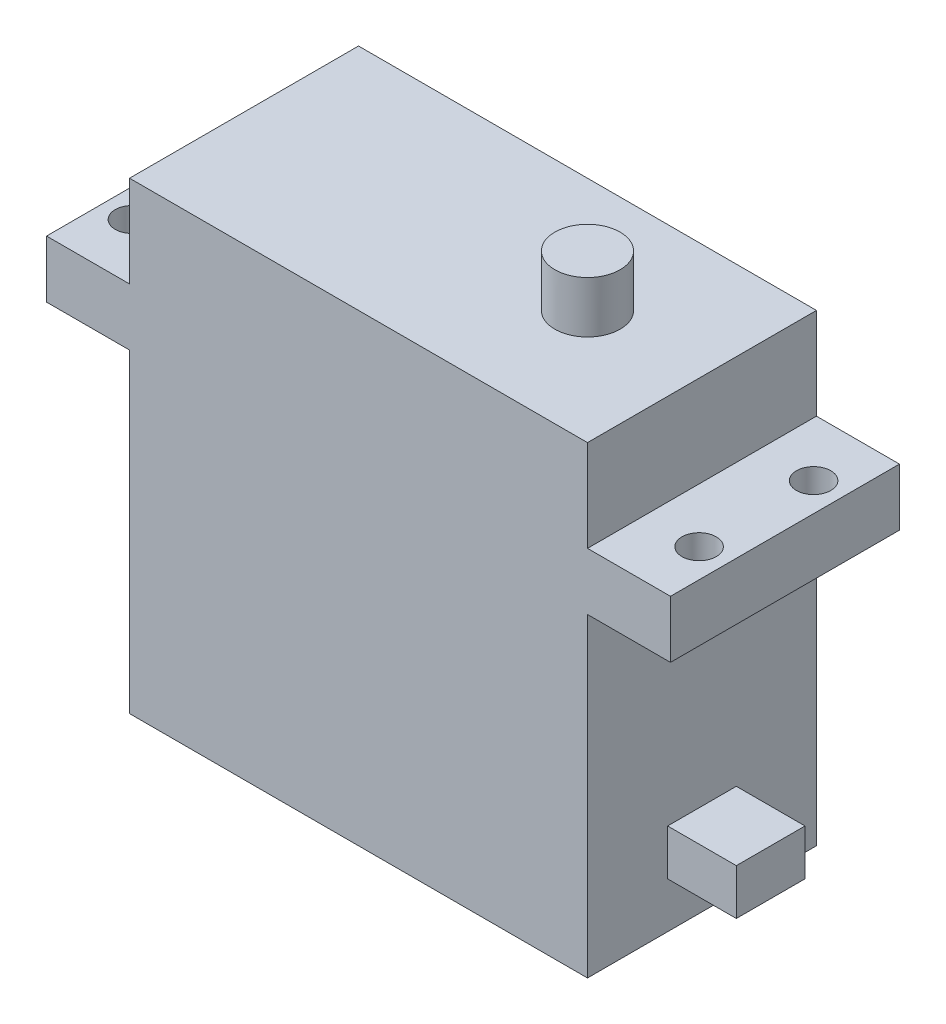
ISO-10303-21;
HEADER;
FILE_DESCRIPTION(('STEP AP214'),'2;1');
FILE_NAME('part.step','',(''),(''),'','','');
FILE_SCHEMA(('AUTOMOTIVE_DESIGN { 1 0 10303 214 1 1 1 1 }'));
ENDSEC;
DATA;
#1=APPLICATION_CONTEXT('core data for automotive mechanical design processes');
#2=APPLICATION_PROTOCOL_DEFINITION('international standard','automotive_design',2000,#1);
#3=PRODUCT_CONTEXT('',#1,'mechanical');
#4=PRODUCT('Part','Part','',(#3));
#5=PRODUCT_RELATED_PRODUCT_CATEGORY('part','',(#4));
#6=PRODUCT_DEFINITION_FORMATION('','',#4);
#7=PRODUCT_DEFINITION_CONTEXT('part definition',#1,'design');
#8=PRODUCT_DEFINITION('design','',#6,#7);
#9=PRODUCT_DEFINITION_SHAPE('','',#8);
#10=(LENGTH_UNIT() NAMED_UNIT(*) SI_UNIT(.MILLI.,.METRE.));
#11=(NAMED_UNIT(*) PLANE_ANGLE_UNIT() SI_UNIT($,.RADIAN.));
#12=(NAMED_UNIT(*) SI_UNIT($,.STERADIAN.) SOLID_ANGLE_UNIT());
#13=UNCERTAINTY_MEASURE_WITH_UNIT(LENGTH_MEASURE(1.E-05),#10,'distance_accuracy_value','');
#14=(GEOMETRIC_REPRESENTATION_CONTEXT(3) GLOBAL_UNCERTAINTY_ASSIGNED_CONTEXT((#13)) GLOBAL_UNIT_ASSIGNED_CONTEXT((#10,
#11,#12)) REPRESENTATION_CONTEXT('',''));
#15=CARTESIAN_POINT('',(0.,0.,0.));
#16=DIRECTION('',(0.,0.,1.));
#17=DIRECTION('',(1.,0.,0.));
#18=AXIS2_PLACEMENT_3D('',#15,#16,#17);
#19=CARTESIAN_POINT('',(20.,0.,20.));
#20=DIRECTION('',(1.,0.,0.));
#21=DIRECTION('',(0.,0.,-1.));
#22=AXIS2_PLACEMENT_3D('',#19,#20,#21);
#23=PLANE('',#22);
#24=DIRECTION('',(0.,-1.,0.));
#25=VECTOR('',#24,1.);
#26=CARTESIAN_POINT('',(20.,0.,0.));
#27=LINE('',#26,#25);
#28=CARTESIAN_POINT('',(20.,-13.,0.));
#29=VERTEX_POINT('',#28);
#30=CARTESIAN_POINT('',(20.,-40.5,0.));
#31=VERTEX_POINT('',#30);
#32=EDGE_CURVE('E209',#29,#31,#27,.T.);
#33=ORIENTED_EDGE('',*,*,#32,.F.);
#34=DIRECTION('',(0.,0.,-1.));
#35=VECTOR('',#34,1.);
#36=CARTESIAN_POINT('',(20.,-13.,20.));
#37=LINE('',#36,#35);
#38=CARTESIAN_POINT('',(20.,-13.,20.));
#39=VERTEX_POINT('',#38);
#40=EDGE_CURVE('E227',#39,#29,#37,.T.);
#41=ORIENTED_EDGE('',*,*,#40,.F.);
#42=DIRECTION('',(0.,-1.,0.));
#43=VECTOR('',#42,1.);
#44=CARTESIAN_POINT('',(20.,0.,20.));
#45=LINE('',#44,#43);
#46=CARTESIAN_POINT('',(20.,-40.5,20.));
#47=VERTEX_POINT('',#46);
#48=EDGE_CURVE('E270',#39,#47,#45,.T.);
#49=ORIENTED_EDGE('',*,*,#48,.T.);
#50=DIRECTION('',(0.,0.,-1.));
#51=VECTOR('',#50,1.);
#52=CARTESIAN_POINT('',(20.,-40.5,20.));
#53=LINE('',#52,#51);
#54=EDGE_CURVE('E229',#47,#31,#53,.T.);
#55=ORIENTED_EDGE('',*,*,#54,.T.);
#56=EDGE_LOOP('',(#33,#41,#49,#55));
#57=FACE_BOUND('',#56,.T.);
#58=DIRECTION('',(0.,0.,1.));
#59=VECTOR('',#58,1.);
#60=CARTESIAN_POINT('',(20.,-32.5,13.));
#61=LINE('',#60,#59);
#62=CARTESIAN_POINT('',(20.,-32.5,7.));
#63=VERTEX_POINT('',#62);
#64=CARTESIAN_POINT('',(20.,-32.5,13.));
#65=VERTEX_POINT('',#64);
#66=EDGE_CURVE('E448',#63,#65,#61,.T.);
#67=ORIENTED_EDGE('',*,*,#66,.F.);
#68=DIRECTION('',(0.,1.,0.));
#69=VECTOR('',#68,1.);
#70=CARTESIAN_POINT('',(20.,-32.5,7.));
#71=LINE('',#70,#69);
#72=CARTESIAN_POINT('',(20.,-36.5,7.));
#73=VERTEX_POINT('',#72);
#74=EDGE_CURVE('E422',#73,#63,#71,.T.);
#75=ORIENTED_EDGE('',*,*,#74,.F.);
#76=DIRECTION('',(0.,0.,-1.));
#77=VECTOR('',#76,1.);
#78=CARTESIAN_POINT('',(20.,-36.5,13.));
#79=LINE('',#78,#77);
#80=CARTESIAN_POINT('',(20.,-36.5,13.));
#81=VERTEX_POINT('',#80);
#82=EDGE_CURVE('E415',#81,#73,#79,.T.);
#83=ORIENTED_EDGE('',*,*,#82,.F.);
#84=DIRECTION('',(0.,-1.,0.));
#85=VECTOR('',#84,1.);
#86=CARTESIAN_POINT('',(20.,-32.5,13.));
#87=LINE('',#86,#85);
#88=EDGE_CURVE('E446',#65,#81,#87,.T.);
#89=ORIENTED_EDGE('',*,*,#88,.F.);
#90=EDGE_LOOP('',(#67,#75,#83,#89));
#91=FACE_BOUND('',#90,.T.);
#92=ADVANCED_FACE('F53',(#57,#91),#23,.T.);
#93=CARTESIAN_POINT('',(-20.,0.,20.));
#94=DIRECTION('',(1.,0.,0.));
#95=DIRECTION('',(0.,0.,-1.));
#96=AXIS2_PLACEMENT_3D('',#93,#94,#95);
#97=PLANE('',#96);
#98=DIRECTION('',(0.,-1.,0.));
#99=VECTOR('',#98,1.);
#100=CARTESIAN_POINT('',(-20.,0.,0.));
#101=LINE('',#100,#99);
#102=CARTESIAN_POINT('',(-20.,0.,0.));
#103=VERTEX_POINT('',#102);
#104=CARTESIAN_POINT('',(-20.,-8.,0.));
#105=VERTEX_POINT('',#104);
#106=EDGE_CURVE('E190',#103,#105,#101,.T.);
#107=ORIENTED_EDGE('',*,*,#106,.T.);
#108=DIRECTION('',(0.,0.,-1.));
#109=VECTOR('',#108,1.);
#110=CARTESIAN_POINT('',(-20.,-8.,20.));
#111=LINE('',#110,#109);
#112=CARTESIAN_POINT('',(-20.,-8.,20.));
#113=VERTEX_POINT('',#112);
#114=EDGE_CURVE('E62',#113,#105,#111,.T.);
#115=ORIENTED_EDGE('',*,*,#114,.F.);
#116=DIRECTION('',(0.,-1.,0.));
#117=VECTOR('',#116,1.);
#118=CARTESIAN_POINT('',(-20.,0.,20.));
#119=LINE('',#118,#117);
#120=CARTESIAN_POINT('',(-20.,0.,20.));
#121=VERTEX_POINT('',#120);
#122=EDGE_CURVE('E221',#121,#113,#119,.T.);
#123=ORIENTED_EDGE('',*,*,#122,.F.);
#124=DIRECTION('',(0.,0.,-1.));
#125=VECTOR('',#124,1.);
#126=CARTESIAN_POINT('',(-20.,0.,20.));
#127=LINE('',#126,#125);
#128=EDGE_CURVE('E186',#121,#103,#127,.T.);
#129=ORIENTED_EDGE('',*,*,#128,.T.);
#130=EDGE_LOOP('',(#107,#115,#123,#129));
#131=FACE_BOUND('',#130,.T.);
#132=ADVANCED_FACE('F55',(#131),#97,.F.);
#133=CARTESIAN_POINT('',(0.,-8.,20.));
#134=DIRECTION('',(0.,-1.,0.));
#135=DIRECTION('',(1.,0.,0.));
#136=AXIS2_PLACEMENT_3D('',#133,#134,#135);
#137=PLANE('',#136);
#138=CARTESIAN_POINT('',(-24.75,-8.00000000000001,15.));
#139=DIRECTION('',(0.,1.,0.));
#140=DIRECTION('',(-1.,0.,0.));
#141=AXIS2_PLACEMENT_3D('',#138,#139,#140);
#142=CIRCLE('',#141,1.5);
#143=CARTESIAN_POINT('',(-26.25,-8.00000000000001,15.));
#144=VERTEX_POINT('',#143);
#145=EDGE_CURVE('E330',#144,#144,#142,.T.);
#146=ORIENTED_EDGE('',*,*,#145,.F.);
#147=EDGE_LOOP('',(#146));
#148=FACE_BOUND('',#147,.T.);
#149=CARTESIAN_POINT('',(-24.75,-8.00000000000001,5.00000000000001));
#150=DIRECTION('',(0.,1.,0.));
#151=DIRECTION('',(-1.,0.,0.));
#152=AXIS2_PLACEMENT_3D('',#149,#150,#151);
#153=CIRCLE('',#152,1.5);
#154=CARTESIAN_POINT('',(-26.25,-8.00000000000001,5.00000000000001));
#155=VERTEX_POINT('',#154);
#156=EDGE_CURVE('E251',#155,#155,#153,.T.);
#157=ORIENTED_EDGE('',*,*,#156,.F.);
#158=EDGE_LOOP('',(#157));
#159=FACE_BOUND('',#158,.T.);
#160=DIRECTION('',(-1.,0.,0.));
#161=VECTOR('',#160,1.);
#162=CARTESIAN_POINT('',(0.,-8.,0.));
#163=LINE('',#162,#161);
#164=CARTESIAN_POINT('',(-27.25,-8.00000000000001,0.));
#165=VERTEX_POINT('',#164);
#166=EDGE_CURVE('E193',#105,#165,#163,.T.);
#167=ORIENTED_EDGE('',*,*,#166,.T.);
#168=DIRECTION('',(0.,0.,-1.));
#169=VECTOR('',#168,1.);
#170=CARTESIAN_POINT('',(-27.25,-8.00000000000001,20.));
#171=LINE('',#170,#169);
#172=CARTESIAN_POINT('',(-27.25,-8.00000000000001,20.));
#173=VERTEX_POINT('',#172);
#174=EDGE_CURVE('E237',#173,#165,#171,.T.);
#175=ORIENTED_EDGE('',*,*,#174,.F.);
#176=DIRECTION('',(-1.,0.,0.));
#177=VECTOR('',#176,1.);
#178=CARTESIAN_POINT('',(0.,-8.,20.));
#179=LINE('',#178,#177);
#180=EDGE_CURVE('E133',#113,#173,#179,.T.);
#181=ORIENTED_EDGE('',*,*,#180,.F.);
#182=ORIENTED_EDGE('',*,*,#114,.T.);
#183=EDGE_LOOP('',(#167,#175,#181,#182));
#184=FACE_BOUND('',#183,.T.);
#185=ADVANCED_FACE('F306',(#148,#159,#184),#137,.F.);
#186=CARTESIAN_POINT('',(-27.25,0.,20.));
#187=DIRECTION('',(-1.,0.,0.));
#188=DIRECTION('',(0.,0.,1.));
#189=AXIS2_PLACEMENT_3D('',#186,#187,#188);
#190=PLANE('',#189);
#191=DIRECTION('',(0.,1.,0.));
#192=VECTOR('',#191,1.);
#193=CARTESIAN_POINT('',(-27.25,0.,0.));
#194=LINE('',#193,#192);
#195=CARTESIAN_POINT('',(-27.25,-13.,0.));
#196=VERTEX_POINT('',#195);
#197=EDGE_CURVE('E197',#196,#165,#194,.T.);
#198=ORIENTED_EDGE('',*,*,#197,.F.);
#199=DIRECTION('',(0.,0.,-1.));
#200=VECTOR('',#199,1.);
#201=CARTESIAN_POINT('',(-27.25,-13.,20.));
#202=LINE('',#201,#200);
#203=CARTESIAN_POINT('',(-27.25,-13.,20.));
#204=VERTEX_POINT('',#203);
#205=EDGE_CURVE('E235',#204,#196,#202,.T.);
#206=ORIENTED_EDGE('',*,*,#205,.F.);
#207=DIRECTION('',(0.,1.,0.));
#208=VECTOR('',#207,1.);
#209=CARTESIAN_POINT('',(-27.25,0.,20.));
#210=LINE('',#209,#208);
#211=EDGE_CURVE('E259',#204,#173,#210,.T.);
#212=ORIENTED_EDGE('',*,*,#211,.T.);
#213=ORIENTED_EDGE('',*,*,#174,.T.);
#214=EDGE_LOOP('',(#198,#206,#212,#213));
#215=FACE_BOUND('',#214,.T.);
#216=ADVANCED_FACE('F319',(#215),#190,.T.);
#217=CARTESIAN_POINT('',(0.,-13.,20.));
#218=DIRECTION('',(0.,-1.,0.));
#219=DIRECTION('',(1.,0.,0.));
#220=AXIS2_PLACEMENT_3D('',#217,#218,#219);
#221=PLANE('',#220);
#222=CARTESIAN_POINT('',(-24.75,-13.,15.));
#223=DIRECTION('',(0.,-1.,0.));
#224=DIRECTION('',(1.,0.,0.));
#225=AXIS2_PLACEMENT_3D('',#222,#223,#224);
#226=CIRCLE('',#225,1.5);
#227=CARTESIAN_POINT('',(-23.25,-13.,15.));
#228=VERTEX_POINT('',#227);
#229=EDGE_CURVE('E57',#228,#228,#226,.T.);
#230=ORIENTED_EDGE('',*,*,#229,.F.);
#231=EDGE_LOOP('',(#230));
#232=FACE_BOUND('',#231,.T.);
#233=CARTESIAN_POINT('',(-24.75,-13.,5.00000000000001));
#234=DIRECTION('',(0.,-1.,0.));
#235=DIRECTION('',(1.,0.,0.));
#236=AXIS2_PLACEMENT_3D('',#233,#234,#235);
#237=CIRCLE('',#236,1.5);
#238=CARTESIAN_POINT('',(-23.25,-13.,5.00000000000001));
#239=VERTEX_POINT('',#238);
#240=EDGE_CURVE('E239',#239,#239,#237,.T.);
#241=ORIENTED_EDGE('',*,*,#240,.F.);
#242=EDGE_LOOP('',(#241));
#243=FACE_BOUND('',#242,.T.);
#244=DIRECTION('',(-1.,0.,0.));
#245=VECTOR('',#244,1.);
#246=CARTESIAN_POINT('',(0.,-13.,0.));
#247=LINE('',#246,#245);
#248=CARTESIAN_POINT('',(-20.,-13.,0.));
#249=VERTEX_POINT('',#248);
#250=EDGE_CURVE('E200',#249,#196,#247,.T.);
#251=ORIENTED_EDGE('',*,*,#250,.F.);
#252=DIRECTION('',(0.,0.,-1.));
#253=VECTOR('',#252,1.);
#254=CARTESIAN_POINT('',(-20.,-13.,20.));
#255=LINE('',#254,#253);
#256=CARTESIAN_POINT('',(-20.,-13.,20.));
#257=VERTEX_POINT('',#256);
#258=EDGE_CURVE('E233',#257,#249,#255,.T.);
#259=ORIENTED_EDGE('',*,*,#258,.F.);
#260=DIRECTION('',(-1.,0.,0.));
#261=VECTOR('',#260,1.);
#262=CARTESIAN_POINT('',(0.,-13.,20.));
#263=LINE('',#262,#261);
#264=EDGE_CURVE('E262',#257,#204,#263,.T.);
#265=ORIENTED_EDGE('',*,*,#264,.T.);
#266=ORIENTED_EDGE('',*,*,#205,.T.);
#267=EDGE_LOOP('',(#251,#259,#265,#266));
#268=FACE_BOUND('',#267,.T.);
#269=ADVANCED_FACE('F315',(#232,#243,#268),#221,.T.);
#270=CARTESIAN_POINT('',(-20.,0.,20.));
#271=DIRECTION('',(1.,0.,0.));
#272=DIRECTION('',(0.,0.,-1.));
#273=AXIS2_PLACEMENT_3D('',#270,#271,#272);
#274=PLANE('',#273);
#275=DIRECTION('',(0.,-1.,0.));
#276=VECTOR('',#275,1.);
#277=CARTESIAN_POINT('',(-20.,0.,0.));
#278=LINE('',#277,#276);
#279=CARTESIAN_POINT('',(-20.,-40.5,0.));
#280=VERTEX_POINT('',#279);
#281=EDGE_CURVE('E203',#249,#280,#278,.T.);
#282=ORIENTED_EDGE('',*,*,#281,.T.);
#283=DIRECTION('',(0.,0.,-1.));
#284=VECTOR('',#283,1.);
#285=CARTESIAN_POINT('',(-20.,-40.5,20.));
#286=LINE('',#285,#284);
#287=CARTESIAN_POINT('',(-20.,-40.5,20.));
#288=VERTEX_POINT('',#287);
#289=EDGE_CURVE('E231',#288,#280,#286,.T.);
#290=ORIENTED_EDGE('',*,*,#289,.F.);
#291=DIRECTION('',(0.,-1.,0.));
#292=VECTOR('',#291,1.);
#293=CARTESIAN_POINT('',(-20.,0.,20.));
#294=LINE('',#293,#292);
#295=EDGE_CURVE('E265',#257,#288,#294,.T.);
#296=ORIENTED_EDGE('',*,*,#295,.F.);
#297=ORIENTED_EDGE('',*,*,#258,.T.);
#298=EDGE_LOOP('',(#282,#290,#296,#297));
#299=FACE_BOUND('',#298,.T.);
#300=ADVANCED_FACE('F311',(#299),#274,.F.);
#301=CARTESIAN_POINT('',(0.,-40.5,20.));
#302=DIRECTION('',(0.,-1.,0.));
#303=DIRECTION('',(0.,0.,-1.));
#304=AXIS2_PLACEMENT_3D('',#301,#302,#303);
#305=PLANE('',#304);
#306=DIRECTION('',(-1.,0.,0.));
#307=VECTOR('',#306,1.);
#308=CARTESIAN_POINT('',(0.,-40.5,0.));
#309=LINE('',#308,#307);
#310=EDGE_CURVE('E206',#31,#280,#309,.T.);
#311=ORIENTED_EDGE('',*,*,#310,.F.);
#312=ORIENTED_EDGE('',*,*,#54,.F.);
#313=DIRECTION('',(-1.,0.,0.));
#314=VECTOR('',#313,1.);
#315=CARTESIAN_POINT('',(0.,-40.5,20.));
#316=LINE('',#315,#314);
#317=EDGE_CURVE('E267',#47,#288,#316,.T.);
#318=ORIENTED_EDGE('',*,*,#317,.T.);
#319=ORIENTED_EDGE('',*,*,#289,.T.);
#320=EDGE_LOOP('',(#311,#312,#318,#319));
#321=FACE_BOUND('',#320,.T.);
#322=ADVANCED_FACE('F298',(#321),#305,.T.);
#323=CARTESIAN_POINT('',(0.,-13.,20.));
#324=DIRECTION('',(0.,-1.,0.));
#325=DIRECTION('',(1.,0.,0.));
#326=AXIS2_PLACEMENT_3D('',#323,#324,#325);
#327=PLANE('',#326);
#328=CARTESIAN_POINT('',(24.75,-13.,4.99999999999999));
#329=DIRECTION('',(0.,-1.,0.));
#330=DIRECTION('',(1.,0.,0.));
#331=AXIS2_PLACEMENT_3D('',#328,#329,#330);
#332=CIRCLE('',#331,1.5);
#333=CARTESIAN_POINT('',(26.25,-13.,4.99999999999999));
#334=VERTEX_POINT('',#333);
#335=EDGE_CURVE('E241',#334,#334,#332,.T.);
#336=ORIENTED_EDGE('',*,*,#335,.F.);
#337=EDGE_LOOP('',(#336));
#338=FACE_BOUND('',#337,.T.);
#339=CARTESIAN_POINT('',(24.75,-13.,15.));
#340=DIRECTION('',(0.,-1.,0.));
#341=DIRECTION('',(1.,0.,0.));
#342=AXIS2_PLACEMENT_3D('',#339,#340,#341);
#343=CIRCLE('',#342,1.5);
#344=CARTESIAN_POINT('',(26.25,-13.,15.));
#345=VERTEX_POINT('',#344);
#346=EDGE_CURVE('E246',#345,#345,#343,.T.);
#347=ORIENTED_EDGE('',*,*,#346,.F.);
#348=EDGE_LOOP('',(#347));
#349=FACE_BOUND('',#348,.T.);
#350=DIRECTION('',(-1.,0.,0.));
#351=VECTOR('',#350,1.);
#352=CARTESIAN_POINT('',(0.,-13.,0.));
#353=LINE('',#352,#351);
#354=CARTESIAN_POINT('',(27.25,-13.,0.));
#355=VERTEX_POINT('',#354);
#356=EDGE_CURVE('E212',#355,#29,#353,.T.);
#357=ORIENTED_EDGE('',*,*,#356,.F.);
#358=DIRECTION('',(0.,0.,-1.));
#359=VECTOR('',#358,1.);
#360=CARTESIAN_POINT('',(27.25,-13.,20.));
#361=LINE('',#360,#359);
#362=CARTESIAN_POINT('',(27.25,-13.,20.));
#363=VERTEX_POINT('',#362);
#364=EDGE_CURVE('E225',#363,#355,#361,.T.);
#365=ORIENTED_EDGE('',*,*,#364,.F.);
#366=DIRECTION('',(-1.,0.,0.));
#367=VECTOR('',#366,1.);
#368=CARTESIAN_POINT('',(0.,-13.,20.));
#369=LINE('',#368,#367);
#370=EDGE_CURVE('E273',#363,#39,#369,.T.);
#371=ORIENTED_EDGE('',*,*,#370,.T.);
#372=ORIENTED_EDGE('',*,*,#40,.T.);
#373=EDGE_LOOP('',(#357,#365,#371,#372));
#374=FACE_BOUND('',#373,.T.);
#375=ADVANCED_FACE('F277',(#338,#349,#374),#327,.T.);
#376=CARTESIAN_POINT('',(27.25,0.,20.));
#377=DIRECTION('',(-1.,0.,0.));
#378=DIRECTION('',(0.,-1.,0.));
#379=AXIS2_PLACEMENT_3D('',#376,#377,#378);
#380=PLANE('',#379);
#381=DIRECTION('',(0.,1.,0.));
#382=VECTOR('',#381,1.);
#383=CARTESIAN_POINT('',(27.25,0.,0.));
#384=LINE('',#383,#382);
#385=CARTESIAN_POINT('',(27.25,-8.,0.));
#386=VERTEX_POINT('',#385);
#387=EDGE_CURVE('E215',#355,#386,#384,.T.);
#388=ORIENTED_EDGE('',*,*,#387,.T.);
#389=DIRECTION('',(0.,0.,-1.));
#390=VECTOR('',#389,1.);
#391=CARTESIAN_POINT('',(27.25,-8.,20.));
#392=LINE('',#391,#390);
#393=CARTESIAN_POINT('',(27.25,-8.,20.));
#394=VERTEX_POINT('',#393);
#395=EDGE_CURVE('E181',#394,#386,#392,.T.);
#396=ORIENTED_EDGE('',*,*,#395,.F.);
#397=DIRECTION('',(0.,1.,0.));
#398=VECTOR('',#397,1.);
#399=CARTESIAN_POINT('',(27.25,0.,20.));
#400=LINE('',#399,#398);
#401=EDGE_CURVE('E168',#363,#394,#400,.T.);
#402=ORIENTED_EDGE('',*,*,#401,.F.);
#403=ORIENTED_EDGE('',*,*,#364,.T.);
#404=EDGE_LOOP('',(#388,#396,#402,#403));
#405=FACE_BOUND('',#404,.T.);
#406=ADVANCED_FACE('F289',(#405),#380,.F.);
#407=CARTESIAN_POINT('',(0.,-8.,20.));
#408=DIRECTION('',(0.,-1.,0.));
#409=DIRECTION('',(1.,0.,0.));
#410=AXIS2_PLACEMENT_3D('',#407,#408,#409);
#411=PLANE('',#410);
#412=CARTESIAN_POINT('',(24.75,-8.,4.99999999999999));
#413=DIRECTION('',(0.,1.,0.));
#414=DIRECTION('',(-1.,0.,0.));
#415=AXIS2_PLACEMENT_3D('',#412,#413,#414);
#416=CIRCLE('',#415,1.5);
#417=CARTESIAN_POINT('',(23.25,-8.,4.99999999999999));
#418=VERTEX_POINT('',#417);
#419=EDGE_CURVE('E425',#418,#418,#416,.T.);
#420=ORIENTED_EDGE('',*,*,#419,.F.);
#421=EDGE_LOOP('',(#420));
#422=FACE_BOUND('',#421,.T.);
#423=CARTESIAN_POINT('',(24.75,-8.,15.));
#424=DIRECTION('',(0.,1.,0.));
#425=DIRECTION('',(-1.,0.,0.));
#426=AXIS2_PLACEMENT_3D('',#423,#424,#425);
#427=CIRCLE('',#426,1.5);
#428=CARTESIAN_POINT('',(23.25,-8.,15.));
#429=VERTEX_POINT('',#428);
#430=EDGE_CURVE('E429',#429,#429,#427,.T.);
#431=ORIENTED_EDGE('',*,*,#430,.F.);
#432=EDGE_LOOP('',(#431));
#433=FACE_BOUND('',#432,.T.);
#434=DIRECTION('',(-1.,0.,0.));
#435=VECTOR('',#434,1.);
#436=CARTESIAN_POINT('',(0.,-8.,0.));
#437=LINE('',#436,#435);
#438=CARTESIAN_POINT('',(20.,-8.,0.));
#439=VERTEX_POINT('',#438);
#440=EDGE_CURVE('E177',#386,#439,#437,.T.);
#441=ORIENTED_EDGE('',*,*,#440,.T.);
#442=DIRECTION('',(0.,0.,-1.));
#443=VECTOR('',#442,1.);
#444=CARTESIAN_POINT('',(20.,-8.,20.));
#445=LINE('',#444,#443);
#446=CARTESIAN_POINT('',(20.,-8.,20.));
#447=VERTEX_POINT('',#446);
#448=EDGE_CURVE('E174',#447,#439,#445,.T.);
#449=ORIENTED_EDGE('',*,*,#448,.F.);
#450=DIRECTION('',(-1.,0.,0.));
#451=VECTOR('',#450,1.);
#452=CARTESIAN_POINT('',(0.,-8.,20.));
#453=LINE('',#452,#451);
#454=EDGE_CURVE('E161',#394,#447,#453,.T.);
#455=ORIENTED_EDGE('',*,*,#454,.F.);
#456=ORIENTED_EDGE('',*,*,#395,.T.);
#457=EDGE_LOOP('',(#441,#449,#455,#456));
#458=FACE_BOUND('',#457,.T.);
#459=ADVANCED_FACE('F175',(#422,#433,#458),#411,.F.);
#460=CARTESIAN_POINT('',(20.,0.,20.));
#461=DIRECTION('',(1.,0.,0.));
#462=DIRECTION('',(0.,0.,-1.));
#463=AXIS2_PLACEMENT_3D('',#460,#461,#462);
#464=PLANE('',#463);
#465=DIRECTION('',(0.,-1.,0.));
#466=VECTOR('',#465,1.);
#467=CARTESIAN_POINT('',(20.,0.,0.));
#468=LINE('',#467,#466);
#469=CARTESIAN_POINT('',(20.,0.,0.));
#470=VERTEX_POINT('',#469);
#471=EDGE_CURVE('E218',#470,#439,#468,.T.);
#472=ORIENTED_EDGE('',*,*,#471,.F.);
#473=DIRECTION('',(0.,0.,-1.));
#474=VECTOR('',#473,1.);
#475=CARTESIAN_POINT('',(20.,0.,20.));
#476=LINE('',#475,#474);
#477=CARTESIAN_POINT('',(20.,0.,20.));
#478=VERTEX_POINT('',#477);
#479=EDGE_CURVE('E182',#478,#470,#476,.T.);
#480=ORIENTED_EDGE('',*,*,#479,.F.);
#481=DIRECTION('',(0.,-1.,0.));
#482=VECTOR('',#481,1.);
#483=CARTESIAN_POINT('',(20.,0.,20.));
#484=LINE('',#483,#482);
#485=EDGE_CURVE('E165',#478,#447,#484,.T.);
#486=ORIENTED_EDGE('',*,*,#485,.T.);
#487=ORIENTED_EDGE('',*,*,#448,.T.);
#488=EDGE_LOOP('',(#472,#480,#486,#487));
#489=FACE_BOUND('',#488,.T.);
#490=ADVANCED_FACE('F184',(#489),#464,.T.);
#491=CARTESIAN_POINT('',(0.,0.,20.));
#492=DIRECTION('',(0.,-1.,0.));
#493=DIRECTION('',(0.,0.,-1.));
#494=AXIS2_PLACEMENT_3D('',#491,#492,#493);
#495=PLANE('',#494);
#496=CARTESIAN_POINT('',(10.,0.,10.));
#497=DIRECTION('',(0.,-1.,0.));
#498=DIRECTION('',(0.,0.,-1.));
#499=AXIS2_PLACEMENT_3D('',#496,#497,#498);
#500=CIRCLE('',#499,2.85);
#501=CARTESIAN_POINT('',(10.,0.,7.15));
#502=VERTEX_POINT('',#501);
#503=EDGE_CURVE('E11',#502,#502,#500,.F.);
#504=ORIENTED_EDGE('',*,*,#503,.F.);
#505=EDGE_LOOP('',(#504));
#506=FACE_BOUND('',#505,.T.);
#507=DIRECTION('',(-1.,0.,0.));
#508=VECTOR('',#507,1.);
#509=CARTESIAN_POINT('',(0.,0.,0.));
#510=LINE('',#509,#508);
#511=EDGE_CURVE('E124',#470,#103,#510,.T.);
#512=ORIENTED_EDGE('',*,*,#511,.T.);
#513=ORIENTED_EDGE('',*,*,#128,.F.);
#514=DIRECTION('',(-1.,0.,0.));
#515=VECTOR('',#514,1.);
#516=CARTESIAN_POINT('',(0.,0.,20.));
#517=LINE('',#516,#515);
#518=EDGE_CURVE('E79',#478,#121,#517,.T.);
#519=ORIENTED_EDGE('',*,*,#518,.F.);
#520=ORIENTED_EDGE('',*,*,#479,.T.);
#521=EDGE_LOOP('',(#512,#513,#519,#520));
#522=FACE_BOUND('',#521,.T.);
#523=ADVANCED_FACE('F343',(#506,#522),#495,.F.);
#524=CARTESIAN_POINT('',(0.,0.,20.));
#525=DIRECTION('',(0.,0.,1.));
#526=DIRECTION('',(1.,0.,0.));
#527=AXIS2_PLACEMENT_3D('',#524,#525,#526);
#528=PLANE('',#527);
#529=ORIENTED_EDGE('',*,*,#122,.T.);
#530=ORIENTED_EDGE('',*,*,#180,.T.);
#531=ORIENTED_EDGE('',*,*,#211,.F.);
#532=ORIENTED_EDGE('',*,*,#264,.F.);
#533=ORIENTED_EDGE('',*,*,#295,.T.);
#534=ORIENTED_EDGE('',*,*,#317,.F.);
#535=ORIENTED_EDGE('',*,*,#48,.F.);
#536=ORIENTED_EDGE('',*,*,#370,.F.);
#537=ORIENTED_EDGE('',*,*,#401,.T.);
#538=ORIENTED_EDGE('',*,*,#454,.T.);
#539=ORIENTED_EDGE('',*,*,#485,.F.);
#540=ORIENTED_EDGE('',*,*,#518,.T.);
#541=EDGE_LOOP('',(#529,#530,#531,#532,#533,#534,#535,#536,#537,#538,#539,#540));
#542=FACE_BOUND('',#541,.T.);
#543=ADVANCED_FACE('F163',(#542),#528,.T.);
#544=CARTESIAN_POINT('',(0.,0.,0.));
#545=DIRECTION('',(0.,0.,1.));
#546=DIRECTION('',(1.,0.,0.));
#547=AXIS2_PLACEMENT_3D('',#544,#545,#546);
#548=PLANE('',#547);
#549=ORIENTED_EDGE('',*,*,#106,.F.);
#550=ORIENTED_EDGE('',*,*,#511,.F.);
#551=ORIENTED_EDGE('',*,*,#471,.T.);
#552=ORIENTED_EDGE('',*,*,#440,.F.);
#553=ORIENTED_EDGE('',*,*,#387,.F.);
#554=ORIENTED_EDGE('',*,*,#356,.T.);
#555=ORIENTED_EDGE('',*,*,#32,.T.);
#556=ORIENTED_EDGE('',*,*,#310,.T.);
#557=ORIENTED_EDGE('',*,*,#281,.F.);
#558=ORIENTED_EDGE('',*,*,#250,.T.);
#559=ORIENTED_EDGE('',*,*,#197,.T.);
#560=ORIENTED_EDGE('',*,*,#166,.F.);
#561=EDGE_LOOP('',(#549,#550,#551,#552,#553,#554,#555,#556,#557,#558,#559,#560));
#562=FACE_BOUND('',#561,.T.);
#563=ADVANCED_FACE('F287',(#562),#548,.F.);
#564=CARTESIAN_POINT('',(10.,4.5,10.));
#565=DIRECTION('',(0.,-1.,0.));
#566=DIRECTION('',(0.,0.,-1.));
#567=AXIS2_PLACEMENT_3D('',#564,#565,#566);
#568=CYLINDRICAL_SURFACE('',#567,2.85);
#569=CARTESIAN_POINT('',(10.,4.5,10.));
#570=DIRECTION('',(0.,1.,0.));
#571=DIRECTION('',(0.,0.,1.));
#572=AXIS2_PLACEMENT_3D('',#569,#570,#571);
#573=CIRCLE('',#572,2.85);
#574=CARTESIAN_POINT('',(10.,4.5,12.85));
#575=VERTEX_POINT('',#574);
#576=EDGE_CURVE('E194',#575,#575,#573,.T.);
#577=ORIENTED_EDGE('',*,*,#576,.F.);
#578=EDGE_LOOP('',(#577));
#579=FACE_BOUND('',#578,.T.);
#580=ORIENTED_EDGE('',*,*,#503,.T.);
#581=EDGE_LOOP('',(#580));
#582=FACE_BOUND('',#581,.T.);
#583=ADVANCED_FACE('F356',(#579,#582),#568,.T.);
#584=CARTESIAN_POINT('',(10.,4.5,10.));
#585=DIRECTION('',(0.,1.,0.));
#586=DIRECTION('',(0.,0.,1.));
#587=AXIS2_PLACEMENT_3D('',#584,#585,#586);
#588=PLANE('',#587);
#589=ORIENTED_EDGE('',*,*,#576,.T.);
#590=EDGE_LOOP('',(#589));
#591=FACE_BOUND('',#590,.T.);
#592=ADVANCED_FACE('F360',(#591),#588,.T.);
#593=CARTESIAN_POINT('',(24.75,-40.5,15.));
#594=DIRECTION('',(0.,1.,0.));
#595=DIRECTION('',(-1.,0.,0.));
#596=AXIS2_PLACEMENT_3D('',#593,#594,#595);
#597=CYLINDRICAL_SURFACE('',#596,1.5);
#598=ORIENTED_EDGE('',*,*,#346,.T.);
#599=EDGE_LOOP('',(#598));
#600=FACE_BOUND('',#599,.T.);
#601=ORIENTED_EDGE('',*,*,#430,.T.);
#602=EDGE_LOOP('',(#601));
#603=FACE_BOUND('',#602,.T.);
#604=ADVANCED_FACE('F364',(#600,#603),#597,.F.);
#605=CARTESIAN_POINT('',(24.75,-40.5,4.99999999999999));
#606=DIRECTION('',(0.,1.,0.));
#607=DIRECTION('',(-1.,0.,0.));
#608=AXIS2_PLACEMENT_3D('',#605,#606,#607);
#609=CYLINDRICAL_SURFACE('',#608,1.5);
#610=ORIENTED_EDGE('',*,*,#335,.T.);
#611=EDGE_LOOP('',(#610));
#612=FACE_BOUND('',#611,.T.);
#613=ORIENTED_EDGE('',*,*,#419,.T.);
#614=EDGE_LOOP('',(#613));
#615=FACE_BOUND('',#614,.T.);
#616=ADVANCED_FACE('F370',(#612,#615),#609,.F.);
#617=CARTESIAN_POINT('',(-24.75,-40.5,5.00000000000001));
#618=DIRECTION('',(0.,1.,0.));
#619=DIRECTION('',(-1.,0.,0.));
#620=AXIS2_PLACEMENT_3D('',#617,#618,#619);
#621=CYLINDRICAL_SURFACE('',#620,1.5);
#622=ORIENTED_EDGE('',*,*,#240,.T.);
#623=EDGE_LOOP('',(#622));
#624=FACE_BOUND('',#623,.T.);
#625=ORIENTED_EDGE('',*,*,#156,.T.);
#626=EDGE_LOOP('',(#625));
#627=FACE_BOUND('',#626,.T.);
#628=ADVANCED_FACE('F366',(#624,#627),#621,.F.);
#629=CARTESIAN_POINT('',(-24.75,-40.5,15.));
#630=DIRECTION('',(0.,1.,0.));
#631=DIRECTION('',(-1.,0.,0.));
#632=AXIS2_PLACEMENT_3D('',#629,#630,#631);
#633=CYLINDRICAL_SURFACE('',#632,1.5);
#634=ORIENTED_EDGE('',*,*,#229,.T.);
#635=EDGE_LOOP('',(#634));
#636=FACE_BOUND('',#635,.T.);
#637=ORIENTED_EDGE('',*,*,#145,.T.);
#638=EDGE_LOOP('',(#637));
#639=FACE_BOUND('',#638,.T.);
#640=ADVANCED_FACE('F369',(#636,#639),#633,.F.);
#641=CARTESIAN_POINT('',(26.,-32.5,7.));
#642=DIRECTION('',(0.,0.,1.));
#643=DIRECTION('',(0.,-1.,0.));
#644=AXIS2_PLACEMENT_3D('',#641,#642,#643);
#645=PLANE('',#644);
#646=ORIENTED_EDGE('',*,*,#74,.T.);
#647=DIRECTION('',(-1.,0.,0.));
#648=VECTOR('',#647,1.);
#649=CARTESIAN_POINT('',(26.,-32.5,7.));
#650=LINE('',#649,#648);
#651=CARTESIAN_POINT('',(26.,-32.5,7.));
#652=VERTEX_POINT('',#651);
#653=EDGE_CURVE('E419',#652,#63,#650,.T.);
#654=ORIENTED_EDGE('',*,*,#653,.F.);
#655=DIRECTION('',(0.,1.,0.));
#656=VECTOR('',#655,1.);
#657=CARTESIAN_POINT('',(26.,-32.5,7.));
#658=LINE('',#657,#656);
#659=CARTESIAN_POINT('',(26.,-36.5,7.));
#660=VERTEX_POINT('',#659);
#661=EDGE_CURVE('E404',#660,#652,#658,.T.);
#662=ORIENTED_EDGE('',*,*,#661,.F.);
#663=DIRECTION('',(-1.,0.,0.));
#664=VECTOR('',#663,1.);
#665=CARTESIAN_POINT('',(26.,-36.5,7.));
#666=LINE('',#665,#664);
#667=EDGE_CURVE('E443',#660,#73,#666,.T.);
#668=ORIENTED_EDGE('',*,*,#667,.T.);
#669=EDGE_LOOP('',(#646,#654,#662,#668));
#670=FACE_BOUND('',#669,.T.);
#671=ADVANCED_FACE('F378',(#670),#645,.F.);
#672=CARTESIAN_POINT('',(26.,-32.5,13.));
#673=DIRECTION('',(0.,-1.,0.));
#674=DIRECTION('',(0.,0.,-1.));
#675=AXIS2_PLACEMENT_3D('',#672,#673,#674);
#676=PLANE('',#675);
#677=ORIENTED_EDGE('',*,*,#66,.T.);
#678=DIRECTION('',(-1.,0.,0.));
#679=VECTOR('',#678,1.);
#680=CARTESIAN_POINT('',(26.,-32.5,13.));
#681=LINE('',#680,#679);
#682=CARTESIAN_POINT('',(26.,-32.5,13.));
#683=VERTEX_POINT('',#682);
#684=EDGE_CURVE('E426',#683,#65,#681,.T.);
#685=ORIENTED_EDGE('',*,*,#684,.F.);
#686=DIRECTION('',(0.,0.,1.));
#687=VECTOR('',#686,1.);
#688=CARTESIAN_POINT('',(26.,-32.5,13.));
#689=LINE('',#688,#687);
#690=EDGE_CURVE('E409',#652,#683,#689,.T.);
#691=ORIENTED_EDGE('',*,*,#690,.F.);
#692=ORIENTED_EDGE('',*,*,#653,.T.);
#693=EDGE_LOOP('',(#677,#685,#691,#692));
#694=FACE_BOUND('',#693,.T.);
#695=ADVANCED_FACE('F382',(#694),#676,.F.);
#696=CARTESIAN_POINT('',(26.,-32.5,13.));
#697=DIRECTION('',(0.,0.,-1.));
#698=DIRECTION('',(-1.,0.,0.));
#699=AXIS2_PLACEMENT_3D('',#696,#697,#698);
#700=PLANE('',#699);
#701=ORIENTED_EDGE('',*,*,#88,.T.);
#702=DIRECTION('',(-1.,0.,0.));
#703=VECTOR('',#702,1.);
#704=CARTESIAN_POINT('',(26.,-36.5,13.));
#705=LINE('',#704,#703);
#706=CARTESIAN_POINT('',(26.,-36.5,13.));
#707=VERTEX_POINT('',#706);
#708=EDGE_CURVE('E70',#707,#81,#705,.T.);
#709=ORIENTED_EDGE('',*,*,#708,.F.);
#710=DIRECTION('',(0.,-1.,0.));
#711=VECTOR('',#710,1.);
#712=CARTESIAN_POINT('',(26.,-32.5,13.));
#713=LINE('',#712,#711);
#714=EDGE_CURVE('E452',#683,#707,#713,.T.);
#715=ORIENTED_EDGE('',*,*,#714,.F.);
#716=ORIENTED_EDGE('',*,*,#684,.T.);
#717=EDGE_LOOP('',(#701,#709,#715,#716));
#718=FACE_BOUND('',#717,.T.);
#719=ADVANCED_FACE('F386',(#718),#700,.F.);
#720=CARTESIAN_POINT('',(26.,-36.5,13.));
#721=DIRECTION('',(0.,1.,0.));
#722=DIRECTION('',(0.,0.,1.));
#723=AXIS2_PLACEMENT_3D('',#720,#721,#722);
#724=PLANE('',#723);
#725=ORIENTED_EDGE('',*,*,#82,.T.);
#726=ORIENTED_EDGE('',*,*,#667,.F.);
#727=DIRECTION('',(0.,0.,-1.));
#728=VECTOR('',#727,1.);
#729=CARTESIAN_POINT('',(26.,-36.5,13.));
#730=LINE('',#729,#728);
#731=EDGE_CURVE('E411',#707,#660,#730,.T.);
#732=ORIENTED_EDGE('',*,*,#731,.F.);
#733=ORIENTED_EDGE('',*,*,#708,.T.);
#734=EDGE_LOOP('',(#725,#726,#732,#733));
#735=FACE_BOUND('',#734,.T.);
#736=ADVANCED_FACE('F390',(#735),#724,.F.);
#737=CARTESIAN_POINT('',(26.,0.,0.));
#738=DIRECTION('',(1.,0.,0.));
#739=DIRECTION('',(0.,0.,-1.));
#740=AXIS2_PLACEMENT_3D('',#737,#738,#739);
#741=PLANE('',#740);
#742=ORIENTED_EDGE('',*,*,#661,.T.);
#743=ORIENTED_EDGE('',*,*,#690,.T.);
#744=ORIENTED_EDGE('',*,*,#714,.T.);
#745=ORIENTED_EDGE('',*,*,#731,.T.);
#746=EDGE_LOOP('',(#742,#743,#744,#745));
#747=FACE_BOUND('',#746,.T.);
#748=ADVANCED_FACE('F394',(#747),#741,.T.);
#749=CLOSED_SHELL('',(#92,#132,#185,#216,#269,#300,#322,#375,#406,#459,#490,#523,#543,#563,#583,
#592,#604,#616,#628,#640,#671,#695,#719,#736,#748));
#750=MANIFOLD_SOLID_BREP('B2',#749);
#751=ADVANCED_BREP_SHAPE_REPRESENTATION('',(#18,#750),#14);
#752=SHAPE_DEFINITION_REPRESENTATION(#9,#751);
ENDSEC;
END-ISO-10303-21;
